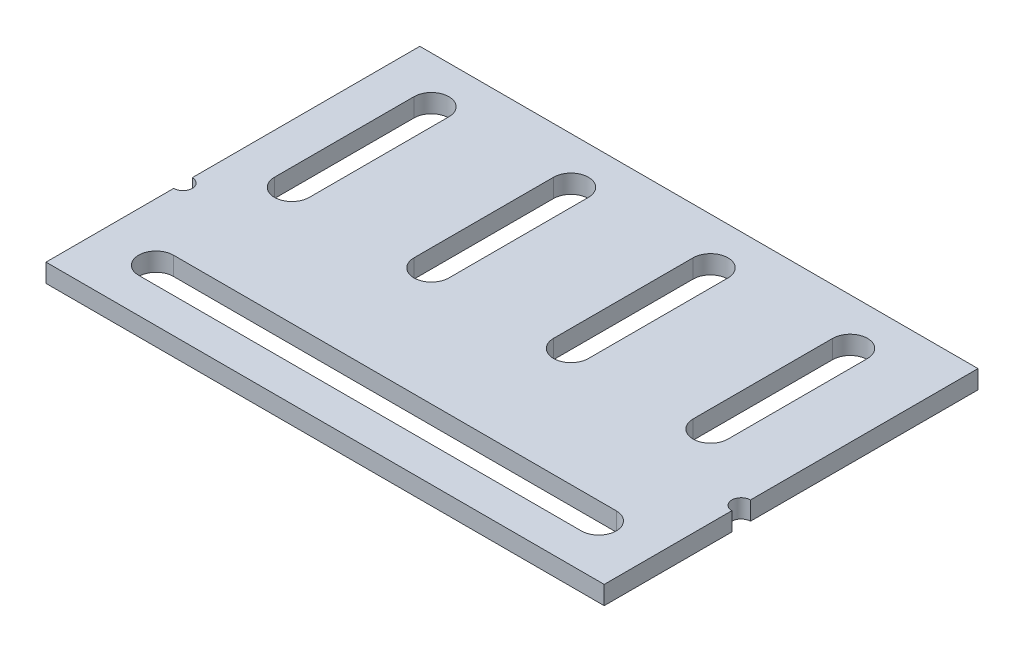
ISO-10303-21;
HEADER;
FILE_DESCRIPTION(('STEP AP214'),'2;1');
FILE_NAME('part.step','',(''),(''),'','','');
FILE_SCHEMA(('AUTOMOTIVE_DESIGN { 1 0 10303 214 1 1 1 1 }'));
ENDSEC;
DATA;
#1=APPLICATION_CONTEXT('core data for automotive mechanical design processes');
#2=APPLICATION_PROTOCOL_DEFINITION('international standard','automotive_design',2000,#1);
#3=PRODUCT_CONTEXT('',#1,'mechanical');
#4=PRODUCT('Part','Part','',(#3));
#5=PRODUCT_RELATED_PRODUCT_CATEGORY('part','',(#4));
#6=PRODUCT_DEFINITION_FORMATION('','',#4);
#7=PRODUCT_DEFINITION_CONTEXT('part definition',#1,'design');
#8=PRODUCT_DEFINITION('design','',#6,#7);
#9=PRODUCT_DEFINITION_SHAPE('','',#8);
#10=(LENGTH_UNIT() NAMED_UNIT(*) SI_UNIT(.MILLI.,.METRE.));
#11=(NAMED_UNIT(*) PLANE_ANGLE_UNIT() SI_UNIT($,.RADIAN.));
#12=(NAMED_UNIT(*) SI_UNIT($,.STERADIAN.) SOLID_ANGLE_UNIT());
#13=UNCERTAINTY_MEASURE_WITH_UNIT(LENGTH_MEASURE(1.E-05),#10,'distance_accuracy_value','');
#14=(GEOMETRIC_REPRESENTATION_CONTEXT(3) GLOBAL_UNCERTAINTY_ASSIGNED_CONTEXT((#13)) GLOBAL_UNIT_ASSIGNED_CONTEXT((#10,
#11,#12)) REPRESENTATION_CONTEXT('',''));
#15=CARTESIAN_POINT('',(0.,0.,0.));
#16=DIRECTION('',(0.,0.,1.));
#17=DIRECTION('',(1.,0.,0.));
#18=AXIS2_PLACEMENT_3D('',#15,#16,#17);
#19=CARTESIAN_POINT('',(120.,50.,-95.7213758827366));
#20=DIRECTION('',(1.,0.,0.));
#21=DIRECTION('',(0.,0.,1.));
#22=AXIS2_PLACEMENT_3D('',#19,#20,#21);
#23=PLANE('',#22);
#24=DIRECTION('',(0.,-1.,0.));
#25=VECTOR('',#24,1.);
#26=CARTESIAN_POINT('',(120.,57.9375,10.1080620586317));
#27=LINE('',#26,#25);
#28=CARTESIAN_POINT('',(120.,57.9375,10.1080620586317));
#29=VERTEX_POINT('',#28);
#30=CARTESIAN_POINT('',(120.,50.,10.1080620586317));
#31=VERTEX_POINT('',#30);
#32=EDGE_CURVE('E223',#29,#31,#27,.T.);
#33=ORIENTED_EDGE('',*,*,#32,.F.);
#34=DIRECTION('',(0.,0.,1.));
#35=VECTOR('',#34,1.);
#36=CARTESIAN_POINT('',(120.,57.9375,-45.7213758827366));
#37=LINE('',#36,#35);
#38=CARTESIAN_POINT('',(120.,57.9375,65.));
#39=VERTEX_POINT('',#38);
#40=EDGE_CURVE('E234',#29,#39,#37,.T.);
#41=ORIENTED_EDGE('',*,*,#40,.T.);
#42=DIRECTION('',(0.,-1.,0.));
#43=VECTOR('',#42,1.);
#44=CARTESIAN_POINT('',(120.,50.,65.));
#45=LINE('',#44,#43);
#46=CARTESIAN_POINT('',(120.,50.,65.));
#47=VERTEX_POINT('',#46);
#48=EDGE_CURVE('E446',#39,#47,#45,.T.);
#49=ORIENTED_EDGE('',*,*,#48,.T.);
#50=DIRECTION('',(0.,0.,1.));
#51=VECTOR('',#50,1.);
#52=CARTESIAN_POINT('',(120.,50.,-95.7213758827366));
#53=LINE('',#52,#51);
#54=EDGE_CURVE('E236',#31,#47,#53,.T.);
#55=ORIENTED_EDGE('',*,*,#54,.F.);
#56=EDGE_LOOP('',(#33,#41,#49,#55));
#57=FACE_BOUND('',#56,.T.);
#58=ADVANCED_FACE('F39',(#57),#23,.T.);
#59=CARTESIAN_POINT('',(-120.,50.,-95.7213758827366));
#60=DIRECTION('',(-1.,0.,0.));
#61=DIRECTION('',(0.,0.,-1.));
#62=AXIS2_PLACEMENT_3D('',#59,#60,#61);
#63=PLANE('',#62);
#64=DIRECTION('',(0.,-1.,0.));
#65=VECTOR('',#64,1.);
#66=CARTESIAN_POINT('',(-120.,57.9375,2.10806205863167));
#67=LINE('',#66,#65);
#68=CARTESIAN_POINT('',(-120.,57.9375,2.10806205863167));
#69=VERTEX_POINT('',#68);
#70=CARTESIAN_POINT('',(-120.,50.,2.10806205863167));
#71=VERTEX_POINT('',#70);
#72=EDGE_CURVE('E411',#69,#71,#67,.T.);
#73=ORIENTED_EDGE('',*,*,#72,.F.);
#74=DIRECTION('',(0.,0.,1.));
#75=VECTOR('',#74,1.);
#76=CARTESIAN_POINT('',(-120.,57.9375,-45.7213758827366));
#77=LINE('',#76,#75);
#78=CARTESIAN_POINT('',(-120.,57.9375,-95.7213758827366));
#79=VERTEX_POINT('',#78);
#80=EDGE_CURVE('E257',#69,#79,#77,.F.);
#81=ORIENTED_EDGE('',*,*,#80,.T.);
#82=DIRECTION('',(0.,-1.,0.));
#83=VECTOR('',#82,1.);
#84=CARTESIAN_POINT('',(-120.,50.,-95.7213758827366));
#85=LINE('',#84,#83);
#86=CARTESIAN_POINT('',(-120.,50.,-95.7213758827366));
#87=VERTEX_POINT('',#86);
#88=EDGE_CURVE('E308',#79,#87,#85,.T.);
#89=ORIENTED_EDGE('',*,*,#88,.T.);
#90=DIRECTION('',(0.,0.,-1.));
#91=VECTOR('',#90,1.);
#92=CARTESIAN_POINT('',(-120.,50.,-95.7213758827366));
#93=LINE('',#92,#91);
#94=EDGE_CURVE('E300',#71,#87,#93,.T.);
#95=ORIENTED_EDGE('',*,*,#94,.F.);
#96=EDGE_LOOP('',(#73,#81,#89,#95));
#97=FACE_BOUND('',#96,.T.);
#98=ADVANCED_FACE('F468',(#97),#63,.T.);
#99=CARTESIAN_POINT('',(92.4999999999999,50.,-15.7213758827366));
#100=DIRECTION('',(1.,0.,0.));
#101=DIRECTION('',(0.,0.,1.));
#102=AXIS2_PLACEMENT_3D('',#99,#100,#101);
#103=PLANE('',#102);
#104=DIRECTION('',(0.,-1.,0.));
#105=VECTOR('',#104,1.);
#106=CARTESIAN_POINT('',(92.4999999999999,50.,-15.7213758827366));
#107=LINE('',#106,#105);
#108=CARTESIAN_POINT('',(92.4999999999999,57.9375,-15.7213758827366));
#109=VERTEX_POINT('',#108);
#110=CARTESIAN_POINT('',(92.4999999999999,50.,-15.7213758827366));
#111=VERTEX_POINT('',#110);
#112=EDGE_CURVE('E47',#109,#111,#107,.T.);
#113=ORIENTED_EDGE('',*,*,#112,.F.);
#114=DIRECTION('',(0.,0.,1.));
#115=VECTOR('',#114,1.);
#116=CARTESIAN_POINT('',(92.4999999999999,57.9375,-45.7213758827366));
#117=LINE('',#116,#115);
#118=CARTESIAN_POINT('',(92.4999999999999,57.9375,-75.7213758827366));
#119=VERTEX_POINT('',#118);
#120=EDGE_CURVE('E301',#119,#109,#117,.T.);
#121=ORIENTED_EDGE('',*,*,#120,.F.);
#122=DIRECTION('',(0.,-1.,0.));
#123=VECTOR('',#122,1.);
#124=CARTESIAN_POINT('',(92.4999999999999,50.,-75.7213758827366));
#125=LINE('',#124,#123);
#126=CARTESIAN_POINT('',(92.4999999999999,50.,-75.7213758827366));
#127=VERTEX_POINT('',#126);
#128=EDGE_CURVE('E338',#119,#127,#125,.T.);
#129=ORIENTED_EDGE('',*,*,#128,.T.);
#130=DIRECTION('',(0.,0.,1.));
#131=VECTOR('',#130,1.);
#132=CARTESIAN_POINT('',(92.4999999999999,50.,-15.7213758827366));
#133=LINE('',#132,#131);
#134=EDGE_CURVE('E360',#127,#111,#133,.T.);
#135=ORIENTED_EDGE('',*,*,#134,.T.);
#136=EDGE_LOOP('',(#113,#121,#129,#135));
#137=FACE_BOUND('',#136,.T.);
#138=ADVANCED_FACE('F493',(#137),#103,.F.);
#139=CARTESIAN_POINT('',(84.9999999999999,50.,-75.7213758827366));
#140=DIRECTION('',(0.,-1.,0.));
#141=DIRECTION('',(1.,0.,0.));
#142=AXIS2_PLACEMENT_3D('',#139,#140,#141);
#143=CYLINDRICAL_SURFACE('',#142,7.5);
#144=ORIENTED_EDGE('',*,*,#128,.F.);
#145=CARTESIAN_POINT('',(84.9999999999999,57.9375,-75.7213758827366));
#146=DIRECTION('',(0.,-1.,0.));
#147=DIRECTION('',(1.,0.,0.));
#148=AXIS2_PLACEMENT_3D('',#145,#146,#147);
#149=CIRCLE('',#148,7.5);
#150=CARTESIAN_POINT('',(77.4999999999999,57.9375,-75.7213758827367));
#151=VERTEX_POINT('',#150);
#152=EDGE_CURVE('E297',#151,#119,#149,.T.);
#153=ORIENTED_EDGE('',*,*,#152,.F.);
#154=DIRECTION('',(0.,-1.,0.));
#155=VECTOR('',#154,1.);
#156=CARTESIAN_POINT('',(77.4999999999999,50.,-75.7213758827367));
#157=LINE('',#156,#155);
#158=CARTESIAN_POINT('',(77.4999999999999,50.,-75.7213758827367));
#159=VERTEX_POINT('',#158);
#160=EDGE_CURVE('E336',#151,#159,#157,.T.);
#161=ORIENTED_EDGE('',*,*,#160,.T.);
#162=CARTESIAN_POINT('',(84.9999999999999,50.,-75.7213758827366));
#163=DIRECTION('',(0.,-1.,0.));
#164=DIRECTION('',(1.,0.,0.));
#165=AXIS2_PLACEMENT_3D('',#162,#163,#164);
#166=CIRCLE('',#165,7.5);
#167=EDGE_CURVE('E252',#159,#127,#166,.T.);
#168=ORIENTED_EDGE('',*,*,#167,.T.);
#169=EDGE_LOOP('',(#144,#153,#161,#168));
#170=FACE_BOUND('',#169,.T.);
#171=ADVANCED_FACE('F554',(#170),#143,.F.);
#172=CARTESIAN_POINT('',(77.4999999999999,50.,-15.7213758827366));
#173=DIRECTION('',(-1.,0.,0.));
#174=DIRECTION('',(0.,0.,-1.));
#175=AXIS2_PLACEMENT_3D('',#172,#173,#174);
#176=PLANE('',#175);
#177=ORIENTED_EDGE('',*,*,#160,.F.);
#178=DIRECTION('',(0.,0.,1.));
#179=VECTOR('',#178,1.);
#180=CARTESIAN_POINT('',(77.4999999999999,57.9375,-45.7213758827366));
#181=LINE('',#180,#179);
#182=CARTESIAN_POINT('',(77.4999999999999,57.9375,-15.7213758827366));
#183=VERTEX_POINT('',#182);
#184=EDGE_CURVE('E288',#183,#151,#181,.F.);
#185=ORIENTED_EDGE('',*,*,#184,.F.);
#186=DIRECTION('',(0.,-1.,0.));
#187=VECTOR('',#186,1.);
#188=CARTESIAN_POINT('',(77.4999999999999,50.,-15.7213758827366));
#189=LINE('',#188,#187);
#190=CARTESIAN_POINT('',(77.4999999999999,50.,-15.7213758827366));
#191=VERTEX_POINT('',#190);
#192=EDGE_CURVE('E334',#183,#191,#189,.T.);
#193=ORIENTED_EDGE('',*,*,#192,.T.);
#194=DIRECTION('',(0.,0.,-1.));
#195=VECTOR('',#194,1.);
#196=CARTESIAN_POINT('',(77.4999999999999,50.,-15.7213758827366));
#197=LINE('',#196,#195);
#198=EDGE_CURVE('E345',#191,#159,#197,.T.);
#199=ORIENTED_EDGE('',*,*,#198,.T.);
#200=EDGE_LOOP('',(#177,#185,#193,#199));
#201=FACE_BOUND('',#200,.T.);
#202=ADVANCED_FACE('F344',(#201),#176,.F.);
#203=CARTESIAN_POINT('',(32.4999999999999,50.,-15.7213758827366));
#204=DIRECTION('',(1.,0.,0.));
#205=DIRECTION('',(0.,0.,1.));
#206=AXIS2_PLACEMENT_3D('',#203,#204,#205);
#207=PLANE('',#206);
#208=DIRECTION('',(0.,-1.,0.));
#209=VECTOR('',#208,1.);
#210=CARTESIAN_POINT('',(32.4999999999999,50.,-15.7213758827366));
#211=LINE('',#210,#209);
#212=CARTESIAN_POINT('',(32.4999999999999,57.9375,-15.7213758827366));
#213=VERTEX_POINT('',#212);
#214=CARTESIAN_POINT('',(32.4999999999999,50.,-15.7213758827366));
#215=VERTEX_POINT('',#214);
#216=EDGE_CURVE('E332',#213,#215,#211,.T.);
#217=ORIENTED_EDGE('',*,*,#216,.F.);
#218=DIRECTION('',(0.,0.,1.));
#219=VECTOR('',#218,1.);
#220=CARTESIAN_POINT('',(32.4999999999999,57.9375,-45.7213758827366));
#221=LINE('',#220,#219);
#222=CARTESIAN_POINT('',(32.4999999999999,57.9375,-75.7213758827366));
#223=VERTEX_POINT('',#222);
#224=EDGE_CURVE('E289',#223,#213,#221,.T.);
#225=ORIENTED_EDGE('',*,*,#224,.F.);
#226=DIRECTION('',(0.,-1.,0.));
#227=VECTOR('',#226,1.);
#228=CARTESIAN_POINT('',(32.4999999999999,50.,-75.7213758827366));
#229=LINE('',#228,#227);
#230=CARTESIAN_POINT('',(32.4999999999999,50.,-75.7213758827366));
#231=VERTEX_POINT('',#230);
#232=EDGE_CURVE('E330',#223,#231,#229,.T.);
#233=ORIENTED_EDGE('',*,*,#232,.T.);
#234=DIRECTION('',(0.,0.,1.));
#235=VECTOR('',#234,1.);
#236=CARTESIAN_POINT('',(32.4999999999999,50.,-15.7213758827366));
#237=LINE('',#236,#235);
#238=EDGE_CURVE('E365',#231,#215,#237,.T.);
#239=ORIENTED_EDGE('',*,*,#238,.T.);
#240=EDGE_LOOP('',(#217,#225,#233,#239));
#241=FACE_BOUND('',#240,.T.);
#242=ADVANCED_FACE('F544',(#241),#207,.F.);
#243=CARTESIAN_POINT('',(24.9999999999999,50.,-75.7213758827366));
#244=DIRECTION('',(0.,-1.,0.));
#245=DIRECTION('',(1.,0.,0.));
#246=AXIS2_PLACEMENT_3D('',#243,#244,#245);
#247=CYLINDRICAL_SURFACE('',#246,7.5);
#248=ORIENTED_EDGE('',*,*,#232,.F.);
#249=CARTESIAN_POINT('',(24.9999999999999,57.9375,-75.7213758827366));
#250=DIRECTION('',(0.,-1.,0.));
#251=DIRECTION('',(1.,0.,0.));
#252=AXIS2_PLACEMENT_3D('',#249,#250,#251);
#253=CIRCLE('',#252,7.5);
#254=CARTESIAN_POINT('',(17.4999999999999,57.9375,-75.7213758827366));
#255=VERTEX_POINT('',#254);
#256=EDGE_CURVE('E285',#255,#223,#253,.T.);
#257=ORIENTED_EDGE('',*,*,#256,.F.);
#258=DIRECTION('',(0.,-1.,0.));
#259=VECTOR('',#258,1.);
#260=CARTESIAN_POINT('',(17.4999999999999,50.,-75.7213758827366));
#261=LINE('',#260,#259);
#262=CARTESIAN_POINT('',(17.4999999999999,50.,-75.7213758827366));
#263=VERTEX_POINT('',#262);
#264=EDGE_CURVE('E328',#255,#263,#261,.T.);
#265=ORIENTED_EDGE('',*,*,#264,.T.);
#266=CARTESIAN_POINT('',(24.9999999999999,50.,-75.7213758827366));
#267=DIRECTION('',(0.,-1.,0.));
#268=DIRECTION('',(1.,0.,0.));
#269=AXIS2_PLACEMENT_3D('',#266,#267,#268);
#270=CIRCLE('',#269,7.5);
#271=EDGE_CURVE('E357',#263,#231,#270,.T.);
#272=ORIENTED_EDGE('',*,*,#271,.T.);
#273=EDGE_LOOP('',(#248,#257,#265,#272));
#274=FACE_BOUND('',#273,.T.);
#275=ADVANCED_FACE('F540',(#274),#247,.F.);
#276=CARTESIAN_POINT('',(17.4999999999999,50.,-15.7213758827366));
#277=DIRECTION('',(-1.,0.,0.));
#278=DIRECTION('',(0.,0.,-1.));
#279=AXIS2_PLACEMENT_3D('',#276,#277,#278);
#280=PLANE('',#279);
#281=ORIENTED_EDGE('',*,*,#264,.F.);
#282=DIRECTION('',(0.,0.,1.));
#283=VECTOR('',#282,1.);
#284=CARTESIAN_POINT('',(17.4999999999999,57.9375,-45.7213758827366));
#285=LINE('',#284,#283);
#286=CARTESIAN_POINT('',(17.4999999999999,57.9375,-15.7213758827366));
#287=VERTEX_POINT('',#286);
#288=EDGE_CURVE('E276',#287,#255,#285,.F.);
#289=ORIENTED_EDGE('',*,*,#288,.F.);
#290=DIRECTION('',(0.,-1.,0.));
#291=VECTOR('',#290,1.);
#292=CARTESIAN_POINT('',(17.4999999999999,50.,-15.7213758827366));
#293=LINE('',#292,#291);
#294=CARTESIAN_POINT('',(17.4999999999999,50.,-15.7213758827366));
#295=VERTEX_POINT('',#294);
#296=EDGE_CURVE('E326',#287,#295,#293,.T.);
#297=ORIENTED_EDGE('',*,*,#296,.T.);
#298=DIRECTION('',(0.,0.,-1.));
#299=VECTOR('',#298,1.);
#300=CARTESIAN_POINT('',(17.4999999999999,50.,-15.7213758827366));
#301=LINE('',#300,#299);
#302=EDGE_CURVE('E371',#295,#263,#301,.T.);
#303=ORIENTED_EDGE('',*,*,#302,.T.);
#304=EDGE_LOOP('',(#281,#289,#297,#303));
#305=FACE_BOUND('',#304,.T.);
#306=ADVANCED_FACE('F532',(#305),#280,.F.);
#307=CARTESIAN_POINT('',(-27.5000000000001,50.,-15.7213758827366));
#308=DIRECTION('',(1.,0.,0.));
#309=DIRECTION('',(0.,0.,1.));
#310=AXIS2_PLACEMENT_3D('',#307,#308,#309);
#311=PLANE('',#310);
#312=DIRECTION('',(0.,-1.,0.));
#313=VECTOR('',#312,1.);
#314=CARTESIAN_POINT('',(-27.5000000000001,50.,-15.7213758827366));
#315=LINE('',#314,#313);
#316=CARTESIAN_POINT('',(-27.5000000000001,57.9375,-15.7213758827366));
#317=VERTEX_POINT('',#316);
#318=CARTESIAN_POINT('',(-27.5000000000001,50.,-15.7213758827366));
#319=VERTEX_POINT('',#318);
#320=EDGE_CURVE('E324',#317,#319,#315,.T.);
#321=ORIENTED_EDGE('',*,*,#320,.F.);
#322=DIRECTION('',(0.,0.,1.));
#323=VECTOR('',#322,1.);
#324=CARTESIAN_POINT('',(-27.5000000000001,57.9375,-45.7213758827366));
#325=LINE('',#324,#323);
#326=CARTESIAN_POINT('',(-27.5000000000001,57.9375,-75.7213758827366));
#327=VERTEX_POINT('',#326);
#328=EDGE_CURVE('E277',#327,#317,#325,.T.);
#329=ORIENTED_EDGE('',*,*,#328,.F.);
#330=DIRECTION('',(0.,-1.,0.));
#331=VECTOR('',#330,1.);
#332=CARTESIAN_POINT('',(-27.5000000000001,50.,-75.7213758827366));
#333=LINE('',#332,#331);
#334=CARTESIAN_POINT('',(-27.5000000000001,50.,-75.7213758827366));
#335=VERTEX_POINT('',#334);
#336=EDGE_CURVE('E322',#327,#335,#333,.T.);
#337=ORIENTED_EDGE('',*,*,#336,.T.);
#338=DIRECTION('',(0.,0.,1.));
#339=VECTOR('',#338,1.);
#340=CARTESIAN_POINT('',(-27.5000000000001,50.,-15.7213758827366));
#341=LINE('',#340,#339);
#342=EDGE_CURVE('E377',#335,#319,#341,.T.);
#343=ORIENTED_EDGE('',*,*,#342,.T.);
#344=EDGE_LOOP('',(#321,#329,#337,#343));
#345=FACE_BOUND('',#344,.T.);
#346=ADVANCED_FACE('F528',(#345),#311,.F.);
#347=CARTESIAN_POINT('',(-35.0000000000001,50.,-75.7213758827366));
#348=DIRECTION('',(0.,-1.,0.));
#349=DIRECTION('',(1.,0.,0.));
#350=AXIS2_PLACEMENT_3D('',#347,#348,#349);
#351=CYLINDRICAL_SURFACE('',#350,7.5);
#352=ORIENTED_EDGE('',*,*,#336,.F.);
#353=CARTESIAN_POINT('',(-35.0000000000001,57.9375,-75.7213758827366));
#354=DIRECTION('',(0.,-1.,0.));
#355=DIRECTION('',(1.,0.,0.));
#356=AXIS2_PLACEMENT_3D('',#353,#354,#355);
#357=CIRCLE('',#356,7.5);
#358=CARTESIAN_POINT('',(-42.5000000000001,57.9375,-75.7213758827366));
#359=VERTEX_POINT('',#358);
#360=EDGE_CURVE('E273',#359,#327,#357,.T.);
#361=ORIENTED_EDGE('',*,*,#360,.F.);
#362=DIRECTION('',(0.,-1.,0.));
#363=VECTOR('',#362,1.);
#364=CARTESIAN_POINT('',(-42.5000000000001,50.,-75.7213758827366));
#365=LINE('',#364,#363);
#366=CARTESIAN_POINT('',(-42.5000000000001,50.,-75.7213758827366));
#367=VERTEX_POINT('',#366);
#368=EDGE_CURVE('E320',#359,#367,#365,.T.);
#369=ORIENTED_EDGE('',*,*,#368,.T.);
#370=CARTESIAN_POINT('',(-35.0000000000001,50.,-75.7213758827366));
#371=DIRECTION('',(0.,-1.,0.));
#372=DIRECTION('',(1.,0.,0.));
#373=AXIS2_PLACEMENT_3D('',#370,#371,#372);
#374=CIRCLE('',#373,7.5);
#375=EDGE_CURVE('E374',#367,#335,#374,.T.);
#376=ORIENTED_EDGE('',*,*,#375,.T.);
#377=EDGE_LOOP('',(#352,#361,#369,#376));
#378=FACE_BOUND('',#377,.T.);
#379=ADVANCED_FACE('F524',(#378),#351,.F.);
#380=CARTESIAN_POINT('',(-42.5,50.,-15.7213758827366));
#381=DIRECTION('',(-1.,0.,0.));
#382=DIRECTION('',(0.,0.,-1.));
#383=AXIS2_PLACEMENT_3D('',#380,#381,#382);
#384=PLANE('',#383);
#385=ORIENTED_EDGE('',*,*,#368,.F.);
#386=DIRECTION('',(0.,0.,1.));
#387=VECTOR('',#386,1.);
#388=CARTESIAN_POINT('',(-42.5,57.9375,-45.7213758827366));
#389=LINE('',#388,#387);
#390=CARTESIAN_POINT('',(-42.5,57.9375,-15.7213758827366));
#391=VERTEX_POINT('',#390);
#392=EDGE_CURVE('E264',#391,#359,#389,.F.);
#393=ORIENTED_EDGE('',*,*,#392,.F.);
#394=DIRECTION('',(0.,-1.,0.));
#395=VECTOR('',#394,1.);
#396=CARTESIAN_POINT('',(-42.5,50.,-15.7213758827366));
#397=LINE('',#396,#395);
#398=CARTESIAN_POINT('',(-42.5,50.,-15.7213758827366));
#399=VERTEX_POINT('',#398);
#400=EDGE_CURVE('E318',#391,#399,#397,.T.);
#401=ORIENTED_EDGE('',*,*,#400,.T.);
#402=DIRECTION('',(0.,0.,-1.));
#403=VECTOR('',#402,1.);
#404=CARTESIAN_POINT('',(-42.5,50.,-15.7213758827366));
#405=LINE('',#404,#403);
#406=EDGE_CURVE('E383',#399,#367,#405,.T.);
#407=ORIENTED_EDGE('',*,*,#406,.T.);
#408=EDGE_LOOP('',(#385,#393,#401,#407));
#409=FACE_BOUND('',#408,.T.);
#410=ADVANCED_FACE('F519',(#409),#384,.F.);
#411=CARTESIAN_POINT('',(-87.5000000000001,50.,-15.7213758827366));
#412=DIRECTION('',(1.,0.,0.));
#413=DIRECTION('',(0.,0.,1.));
#414=AXIS2_PLACEMENT_3D('',#411,#412,#413);
#415=PLANE('',#414);
#416=DIRECTION('',(0.,-1.,0.));
#417=VECTOR('',#416,1.);
#418=CARTESIAN_POINT('',(-87.5000000000001,50.,-15.7213758827366));
#419=LINE('',#418,#417);
#420=CARTESIAN_POINT('',(-87.5000000000001,57.9375,-15.7213758827366));
#421=VERTEX_POINT('',#420);
#422=CARTESIAN_POINT('',(-87.5000000000001,50.,-15.7213758827366));
#423=VERTEX_POINT('',#422);
#424=EDGE_CURVE('E316',#421,#423,#419,.T.);
#425=ORIENTED_EDGE('',*,*,#424,.F.);
#426=DIRECTION('',(0.,0.,1.));
#427=VECTOR('',#426,1.);
#428=CARTESIAN_POINT('',(-87.5,57.9375,-45.7213758827366));
#429=LINE('',#428,#427);
#430=CARTESIAN_POINT('',(-87.5,57.9375,-75.7213758827366));
#431=VERTEX_POINT('',#430);
#432=EDGE_CURVE('E265',#431,#421,#429,.T.);
#433=ORIENTED_EDGE('',*,*,#432,.F.);
#434=DIRECTION('',(0.,-1.,0.));
#435=VECTOR('',#434,1.);
#436=CARTESIAN_POINT('',(-87.5,50.,-75.7213758827366));
#437=LINE('',#436,#435);
#438=CARTESIAN_POINT('',(-87.5,50.,-75.7213758827366));
#439=VERTEX_POINT('',#438);
#440=EDGE_CURVE('E314',#431,#439,#437,.T.);
#441=ORIENTED_EDGE('',*,*,#440,.T.);
#442=DIRECTION('',(0.,0.,1.));
#443=VECTOR('',#442,1.);
#444=CARTESIAN_POINT('',(-87.5000000000001,50.,-15.7213758827366));
#445=LINE('',#444,#443);
#446=EDGE_CURVE('E389',#439,#423,#445,.T.);
#447=ORIENTED_EDGE('',*,*,#446,.T.);
#448=EDGE_LOOP('',(#425,#433,#441,#447));
#449=FACE_BOUND('',#448,.T.);
#450=ADVANCED_FACE('F516',(#449),#415,.F.);
#451=CARTESIAN_POINT('',(-95.0000000000001,50.,-75.7213758827366));
#452=DIRECTION('',(0.,-1.,0.));
#453=DIRECTION('',(1.,0.,0.));
#454=AXIS2_PLACEMENT_3D('',#451,#452,#453);
#455=CYLINDRICAL_SURFACE('',#454,7.50000000000003);
#456=ORIENTED_EDGE('',*,*,#440,.F.);
#457=CARTESIAN_POINT('',(-95.0000000000001,57.9375,-75.7213758827366));
#458=DIRECTION('',(0.,-1.,0.));
#459=DIRECTION('',(1.,0.,0.));
#460=AXIS2_PLACEMENT_3D('',#457,#458,#459);
#461=CIRCLE('',#460,7.50000000000003);
#462=CARTESIAN_POINT('',(-102.5,57.9375,-75.7213758827366));
#463=VERTEX_POINT('',#462);
#464=EDGE_CURVE('E261',#463,#431,#461,.T.);
#465=ORIENTED_EDGE('',*,*,#464,.F.);
#466=DIRECTION('',(0.,-1.,0.));
#467=VECTOR('',#466,1.);
#468=CARTESIAN_POINT('',(-102.5,50.,-75.7213758827366));
#469=LINE('',#468,#467);
#470=CARTESIAN_POINT('',(-102.5,50.,-75.7213758827366));
#471=VERTEX_POINT('',#470);
#472=EDGE_CURVE('E312',#463,#471,#469,.T.);
#473=ORIENTED_EDGE('',*,*,#472,.T.);
#474=CARTESIAN_POINT('',(-95.0000000000001,50.,-75.7213758827366));
#475=DIRECTION('',(0.,-1.,0.));
#476=DIRECTION('',(1.,0.,0.));
#477=AXIS2_PLACEMENT_3D('',#474,#475,#476);
#478=CIRCLE('',#477,7.50000000000003);
#479=EDGE_CURVE('E386',#471,#439,#478,.T.);
#480=ORIENTED_EDGE('',*,*,#479,.T.);
#481=EDGE_LOOP('',(#456,#465,#473,#480));
#482=FACE_BOUND('',#481,.T.);
#483=ADVANCED_FACE('F512',(#482),#455,.F.);
#484=CARTESIAN_POINT('',(-102.5,50.,-15.7213758827366));
#485=DIRECTION('',(-1.,0.,0.));
#486=DIRECTION('',(0.,0.,-1.));
#487=AXIS2_PLACEMENT_3D('',#484,#485,#486);
#488=PLANE('',#487);
#489=ORIENTED_EDGE('',*,*,#472,.F.);
#490=DIRECTION('',(0.,0.,1.));
#491=VECTOR('',#490,1.);
#492=CARTESIAN_POINT('',(-102.5,57.9375,-45.7213758827366));
#493=LINE('',#492,#491);
#494=CARTESIAN_POINT('',(-102.5,57.9375,-15.7213758827366));
#495=VERTEX_POINT('',#494);
#496=EDGE_CURVE('E247',#495,#463,#493,.F.);
#497=ORIENTED_EDGE('',*,*,#496,.F.);
#498=DIRECTION('',(0.,-1.,0.));
#499=VECTOR('',#498,1.);
#500=CARTESIAN_POINT('',(-102.5,50.,-15.7213758827366));
#501=LINE('',#500,#499);
#502=CARTESIAN_POINT('',(-102.5,50.,-15.7213758827366));
#503=VERTEX_POINT('',#502);
#504=EDGE_CURVE('E311',#495,#503,#501,.T.);
#505=ORIENTED_EDGE('',*,*,#504,.T.);
#506=DIRECTION('',(0.,0.,-1.));
#507=VECTOR('',#506,1.);
#508=CARTESIAN_POINT('',(-102.5,50.,-15.7213758827366));
#509=LINE('',#508,#507);
#510=EDGE_CURVE('E395',#503,#471,#509,.T.);
#511=ORIENTED_EDGE('',*,*,#510,.T.);
#512=EDGE_LOOP('',(#489,#497,#505,#511));
#513=FACE_BOUND('',#512,.T.);
#514=ADVANCED_FACE('F508',(#513),#488,.F.);
#515=DIRECTION('',(0.,-1.,0.));
#516=VECTOR('',#515,1.);
#517=CARTESIAN_POINT('',(-120.,57.9375,10.1080620586317));
#518=LINE('',#517,#516);
#519=CARTESIAN_POINT('',(-120.,50.,10.1080620586317));
#520=VERTEX_POINT('',#519);
#521=CARTESIAN_POINT('',(-120.,57.9375,10.1080620586317));
#522=VERTEX_POINT('',#521);
#523=EDGE_CURVE('E62',#520,#522,#518,.F.);
#524=ORIENTED_EDGE('',*,*,#523,.F.);
#525=CARTESIAN_POINT('',(-120.,50.,65.));
#526=VERTEX_POINT('',#525);
#527=EDGE_CURVE('E404',#526,#520,#93,.T.);
#528=ORIENTED_EDGE('',*,*,#527,.F.);
#529=DIRECTION('',(0.,-1.,0.));
#530=VECTOR('',#529,1.);
#531=CARTESIAN_POINT('',(-120.,50.,65.));
#532=LINE('',#531,#530);
#533=CARTESIAN_POINT('',(-120.,57.9375,65.));
#534=VERTEX_POINT('',#533);
#535=EDGE_CURVE('E407',#534,#526,#532,.T.);
#536=ORIENTED_EDGE('',*,*,#535,.F.);
#537=EDGE_CURVE('E249',#534,#522,#77,.F.);
#538=ORIENTED_EDGE('',*,*,#537,.T.);
#539=EDGE_LOOP('',(#524,#528,#536,#538));
#540=FACE_BOUND('',#539,.T.);
#541=ADVANCED_FACE('F473',(#540),#63,.T.);
#542=CARTESIAN_POINT('',(120.,50.,-95.7213758827366));
#543=DIRECTION('',(0.,0.,-1.));
#544=DIRECTION('',(1.,0.,0.));
#545=AXIS2_PLACEMENT_3D('',#542,#543,#544);
#546=PLANE('',#545);
#547=ORIENTED_EDGE('',*,*,#88,.F.);
#548=DIRECTION('',(1.,0.,0.));
#549=VECTOR('',#548,1.);
#550=CARTESIAN_POINT('',(0.,57.9375,-95.7213758827366));
#551=LINE('',#550,#549);
#552=CARTESIAN_POINT('',(120.,57.9375,-95.7213758827366));
#553=VERTEX_POINT('',#552);
#554=EDGE_CURVE('E245',#79,#553,#551,.T.);
#555=ORIENTED_EDGE('',*,*,#554,.T.);
#556=DIRECTION('',(0.,-1.,0.));
#557=VECTOR('',#556,1.);
#558=CARTESIAN_POINT('',(120.,50.,-95.7213758827366));
#559=LINE('',#558,#557);
#560=CARTESIAN_POINT('',(120.,50.,-95.7213758827366));
#561=VERTEX_POINT('',#560);
#562=EDGE_CURVE('E306',#553,#561,#559,.T.);
#563=ORIENTED_EDGE('',*,*,#562,.T.);
#564=DIRECTION('',(1.,0.,0.));
#565=VECTOR('',#564,1.);
#566=CARTESIAN_POINT('',(120.,50.,-95.7213758827366));
#567=LINE('',#566,#565);
#568=EDGE_CURVE('E401',#87,#561,#567,.T.);
#569=ORIENTED_EDGE('',*,*,#568,.F.);
#570=EDGE_LOOP('',(#547,#555,#563,#569));
#571=FACE_BOUND('',#570,.T.);
#572=ADVANCED_FACE('F463',(#571),#546,.T.);
#573=DIRECTION('',(0.,-1.,0.));
#574=VECTOR('',#573,1.);
#575=CARTESIAN_POINT('',(120.,57.9375,2.10806205863169));
#576=LINE('',#575,#574);
#577=CARTESIAN_POINT('',(120.,50.,2.10806205863169));
#578=VERTEX_POINT('',#577);
#579=CARTESIAN_POINT('',(120.,57.9375,2.10806205863169));
#580=VERTEX_POINT('',#579);
#581=EDGE_CURVE('E54',#578,#580,#576,.F.);
#582=ORIENTED_EDGE('',*,*,#581,.F.);
#583=EDGE_CURVE('E398',#561,#578,#53,.T.);
#584=ORIENTED_EDGE('',*,*,#583,.F.);
#585=ORIENTED_EDGE('',*,*,#562,.F.);
#586=EDGE_CURVE('E244',#553,#580,#37,.T.);
#587=ORIENTED_EDGE('',*,*,#586,.T.);
#588=EDGE_LOOP('',(#582,#584,#585,#587));
#589=FACE_BOUND('',#588,.T.);
#590=ADVANCED_FACE('F456',(#589),#23,.T.);
#591=CARTESIAN_POINT('',(-95.0000000000001,50.,-15.7213758827366));
#592=DIRECTION('',(0.,-1.,0.));
#593=DIRECTION('',(1.,0.,0.));
#594=AXIS2_PLACEMENT_3D('',#591,#592,#593);
#595=CYLINDRICAL_SURFACE('',#594,7.50000000000001);
#596=CARTESIAN_POINT('',(-95.0000000000001,57.9375,-15.7213758827366));
#597=DIRECTION('',(0.,-1.,0.));
#598=DIRECTION('',(1.,0.,0.));
#599=AXIS2_PLACEMENT_3D('',#596,#597,#598);
#600=CIRCLE('',#599,7.50000000000001);
#601=EDGE_CURVE('E260',#421,#495,#600,.T.);
#602=ORIENTED_EDGE('',*,*,#601,.F.);
#603=ORIENTED_EDGE('',*,*,#424,.T.);
#604=CARTESIAN_POINT('',(-95.0000000000001,50.,-15.7213758827366));
#605=DIRECTION('',(0.,-1.,0.));
#606=DIRECTION('',(1.,0.,0.));
#607=AXIS2_PLACEMENT_3D('',#604,#605,#606);
#608=CIRCLE('',#607,7.50000000000001);
#609=EDGE_CURVE('E392',#423,#503,#608,.T.);
#610=ORIENTED_EDGE('',*,*,#609,.T.);
#611=ORIENTED_EDGE('',*,*,#504,.F.);
#612=EDGE_LOOP('',(#602,#603,#610,#611));
#613=FACE_BOUND('',#612,.T.);
#614=ADVANCED_FACE('F497',(#613),#595,.F.);
#615=CARTESIAN_POINT('',(-35.0000000000001,50.,-15.7213758827366));
#616=DIRECTION('',(0.,-1.,0.));
#617=DIRECTION('',(1.,0.,0.));
#618=AXIS2_PLACEMENT_3D('',#615,#616,#617);
#619=CYLINDRICAL_SURFACE('',#618,7.49999999999999);
#620=CARTESIAN_POINT('',(-35.0000000000001,57.9375,-15.7213758827366));
#621=DIRECTION('',(0.,-1.,0.));
#622=DIRECTION('',(1.,0.,0.));
#623=AXIS2_PLACEMENT_3D('',#620,#621,#622);
#624=CIRCLE('',#623,7.49999999999999);
#625=EDGE_CURVE('E272',#317,#391,#624,.T.);
#626=ORIENTED_EDGE('',*,*,#625,.F.);
#627=ORIENTED_EDGE('',*,*,#320,.T.);
#628=CARTESIAN_POINT('',(-35.0000000000001,50.,-15.7213758827366));
#629=DIRECTION('',(0.,-1.,0.));
#630=DIRECTION('',(1.,0.,0.));
#631=AXIS2_PLACEMENT_3D('',#628,#629,#630);
#632=CIRCLE('',#631,7.49999999999999);
#633=EDGE_CURVE('E380',#319,#399,#632,.T.);
#634=ORIENTED_EDGE('',*,*,#633,.T.);
#635=ORIENTED_EDGE('',*,*,#400,.F.);
#636=EDGE_LOOP('',(#626,#627,#634,#635));
#637=FACE_BOUND('',#636,.T.);
#638=ADVANCED_FACE('F502',(#637),#619,.F.);
#639=CARTESIAN_POINT('',(24.9999999999999,50.,-15.7213758827366));
#640=DIRECTION('',(0.,-1.,0.));
#641=DIRECTION('',(1.,0.,0.));
#642=AXIS2_PLACEMENT_3D('',#639,#640,#641);
#643=CYLINDRICAL_SURFACE('',#642,7.5);
#644=CARTESIAN_POINT('',(24.9999999999999,57.9375,-15.7213758827366));
#645=DIRECTION('',(0.,-1.,0.));
#646=DIRECTION('',(1.,0.,0.));
#647=AXIS2_PLACEMENT_3D('',#644,#645,#646);
#648=CIRCLE('',#647,7.5);
#649=EDGE_CURVE('E284',#213,#287,#648,.T.);
#650=ORIENTED_EDGE('',*,*,#649,.F.);
#651=ORIENTED_EDGE('',*,*,#216,.T.);
#652=CARTESIAN_POINT('',(24.9999999999999,50.,-15.7213758827366));
#653=DIRECTION('',(0.,-1.,0.));
#654=DIRECTION('',(1.,0.,0.));
#655=AXIS2_PLACEMENT_3D('',#652,#653,#654);
#656=CIRCLE('',#655,7.5);
#657=EDGE_CURVE('E368',#215,#295,#656,.T.);
#658=ORIENTED_EDGE('',*,*,#657,.T.);
#659=ORIENTED_EDGE('',*,*,#296,.F.);
#660=EDGE_LOOP('',(#650,#651,#658,#659));
#661=FACE_BOUND('',#660,.T.);
#662=ADVANCED_FACE('F536',(#661),#643,.F.);
#663=CARTESIAN_POINT('',(84.9999999999999,50.,-15.7213758827366));
#664=DIRECTION('',(0.,-1.,0.));
#665=DIRECTION('',(1.,0.,0.));
#666=AXIS2_PLACEMENT_3D('',#663,#664,#665);
#667=CYLINDRICAL_SURFACE('',#666,7.49999999999999);
#668=CARTESIAN_POINT('',(84.9999999999999,57.9375,-15.7213758827366));
#669=DIRECTION('',(0.,-1.,0.));
#670=DIRECTION('',(1.,0.,0.));
#671=AXIS2_PLACEMENT_3D('',#668,#669,#670);
#672=CIRCLE('',#671,7.49999999999999);
#673=EDGE_CURVE('E296',#109,#183,#672,.T.);
#674=ORIENTED_EDGE('',*,*,#673,.F.);
#675=ORIENTED_EDGE('',*,*,#112,.T.);
#676=CARTESIAN_POINT('',(84.9999999999999,50.,-15.7213758827366));
#677=DIRECTION('',(0.,-1.,0.));
#678=DIRECTION('',(1.,0.,0.));
#679=AXIS2_PLACEMENT_3D('',#676,#677,#678);
#680=CIRCLE('',#679,7.49999999999999);
#681=EDGE_CURVE('E354',#111,#191,#680,.T.);
#682=ORIENTED_EDGE('',*,*,#681,.T.);
#683=ORIENTED_EDGE('',*,*,#192,.F.);
#684=EDGE_LOOP('',(#674,#675,#682,#683));
#685=FACE_BOUND('',#684,.T.);
#686=ADVANCED_FACE('F359',(#685),#667,.F.);
#687=CARTESIAN_POINT('',(0.,50.,0.));
#688=DIRECTION('',(0.,-1.,0.));
#689=DIRECTION('',(1.,0.,0.));
#690=AXIS2_PLACEMENT_3D('',#687,#688,#689);
#691=PLANE('',#690);
#692=CARTESIAN_POINT('',(120.,50.,6.1080620586317));
#693=DIRECTION('',(0.,-1.,0.));
#694=DIRECTION('',(1.,0.,0.));
#695=AXIS2_PLACEMENT_3D('',#692,#693,#694);
#696=CIRCLE('',#695,4.00000000000001);
#697=EDGE_CURVE('E229',#31,#578,#696,.T.);
#698=ORIENTED_EDGE('',*,*,#697,.F.);
#699=ORIENTED_EDGE('',*,*,#54,.T.);
#700=DIRECTION('',(1.,0.,0.));
#701=VECTOR('',#700,1.);
#702=CARTESIAN_POINT('',(120.,50.,65.));
#703=LINE('',#702,#701);
#704=EDGE_CURVE('E410',#526,#47,#703,.T.);
#705=ORIENTED_EDGE('',*,*,#704,.F.);
#706=ORIENTED_EDGE('',*,*,#527,.T.);
#707=CARTESIAN_POINT('',(-120.,50.,6.10806205863168));
#708=DIRECTION('',(0.,-1.,0.));
#709=DIRECTION('',(1.,0.,0.));
#710=AXIS2_PLACEMENT_3D('',#707,#708,#709);
#711=CIRCLE('',#710,4.00000000000001);
#712=EDGE_CURVE('E237',#71,#520,#711,.T.);
#713=ORIENTED_EDGE('',*,*,#712,.F.);
#714=ORIENTED_EDGE('',*,*,#94,.T.);
#715=ORIENTED_EDGE('',*,*,#568,.T.);
#716=ORIENTED_EDGE('',*,*,#583,.T.);
#717=EDGE_LOOP('',(#698,#699,#705,#706,#713,#714,#715,#716));
#718=FACE_BOUND('',#717,.T.);
#719=ORIENTED_EDGE('',*,*,#510,.F.);
#720=ORIENTED_EDGE('',*,*,#609,.F.);
#721=ORIENTED_EDGE('',*,*,#446,.F.);
#722=ORIENTED_EDGE('',*,*,#479,.F.);
#723=EDGE_LOOP('',(#719,#720,#721,#722));
#724=FACE_BOUND('',#723,.T.);
#725=ORIENTED_EDGE('',*,*,#406,.F.);
#726=ORIENTED_EDGE('',*,*,#633,.F.);
#727=ORIENTED_EDGE('',*,*,#342,.F.);
#728=ORIENTED_EDGE('',*,*,#375,.F.);
#729=EDGE_LOOP('',(#725,#726,#727,#728));
#730=FACE_BOUND('',#729,.T.);
#731=ORIENTED_EDGE('',*,*,#302,.F.);
#732=ORIENTED_EDGE('',*,*,#657,.F.);
#733=ORIENTED_EDGE('',*,*,#238,.F.);
#734=ORIENTED_EDGE('',*,*,#271,.F.);
#735=EDGE_LOOP('',(#731,#732,#733,#734));
#736=FACE_BOUND('',#735,.T.);
#737=ORIENTED_EDGE('',*,*,#198,.F.);
#738=ORIENTED_EDGE('',*,*,#681,.F.);
#739=ORIENTED_EDGE('',*,*,#134,.F.);
#740=ORIENTED_EDGE('',*,*,#167,.F.);
#741=EDGE_LOOP('',(#737,#738,#739,#740));
#742=FACE_BOUND('',#741,.T.);
#743=DIRECTION('',(-1.,0.,0.));
#744=VECTOR('',#743,1.);
#745=CARTESIAN_POINT('',(-95.1844120464449,50.,35.));
#746=LINE('',#745,#744);
#747=CARTESIAN_POINT('',(95.1844120464449,50.,35.));
#748=VERTEX_POINT('',#747);
#749=CARTESIAN_POINT('',(-95.1844120464449,50.,35.));
#750=VERTEX_POINT('',#749);
#751=EDGE_CURVE('E434',#748,#750,#746,.T.);
#752=ORIENTED_EDGE('',*,*,#751,.T.);
#753=CARTESIAN_POINT('',(-95.1844120464449,50.,42.5));
#754=DIRECTION('',(0.,1.,0.));
#755=DIRECTION('',(-1.,0.,0.));
#756=AXIS2_PLACEMENT_3D('',#753,#754,#755);
#757=CIRCLE('',#756,7.5);
#758=CARTESIAN_POINT('',(-95.1844120464449,50.,50.));
#759=VERTEX_POINT('',#758);
#760=EDGE_CURVE('E437',#750,#759,#757,.T.);
#761=ORIENTED_EDGE('',*,*,#760,.T.);
#762=DIRECTION('',(1.,0.,0.));
#763=VECTOR('',#762,1.);
#764=CARTESIAN_POINT('',(-95.1844120464449,50.,50.));
#765=LINE('',#764,#763);
#766=CARTESIAN_POINT('',(95.1844120464449,50.,50.));
#767=VERTEX_POINT('',#766);
#768=EDGE_CURVE('E440',#759,#767,#765,.T.);
#769=ORIENTED_EDGE('',*,*,#768,.T.);
#770=CARTESIAN_POINT('',(95.1844120464449,50.,42.5));
#771=DIRECTION('',(0.,1.,0.));
#772=DIRECTION('',(-1.,0.,0.));
#773=AXIS2_PLACEMENT_3D('',#770,#771,#772);
#774=CIRCLE('',#773,7.5);
#775=EDGE_CURVE('E443',#767,#748,#774,.T.);
#776=ORIENTED_EDGE('',*,*,#775,.T.);
#777=EDGE_LOOP('',(#752,#761,#769,#776));
#778=FACE_BOUND('',#777,.T.);
#779=ADVANCED_FACE('F41',(#718,#724,#730,#736,#742,#778),#691,.T.);
#780=CARTESIAN_POINT('',(0.,57.9375,-45.7213758827366));
#781=DIRECTION('',(0.,-1.,0.));
#782=DIRECTION('',(1.,0.,0.));
#783=AXIS2_PLACEMENT_3D('',#780,#781,#782);
#784=PLANE('',#783);
#785=ORIENTED_EDGE('',*,*,#40,.F.);
#786=CARTESIAN_POINT('',(120.,57.9375,6.1080620586317));
#787=DIRECTION('',(0.,-1.,0.));
#788=DIRECTION('',(1.,0.,0.));
#789=AXIS2_PLACEMENT_3D('',#786,#787,#788);
#790=CIRCLE('',#789,4.00000000000001);
#791=EDGE_CURVE('E220',#29,#580,#790,.T.);
#792=ORIENTED_EDGE('',*,*,#791,.T.);
#793=ORIENTED_EDGE('',*,*,#586,.F.);
#794=ORIENTED_EDGE('',*,*,#554,.F.);
#795=ORIENTED_EDGE('',*,*,#80,.F.);
#796=CARTESIAN_POINT('',(-120.,57.9375,6.10806205863168));
#797=DIRECTION('',(0.,-1.,0.));
#798=DIRECTION('',(1.,0.,0.));
#799=AXIS2_PLACEMENT_3D('',#796,#797,#798);
#800=CIRCLE('',#799,4.00000000000001);
#801=EDGE_CURVE('E12',#69,#522,#800,.T.);
#802=ORIENTED_EDGE('',*,*,#801,.T.);
#803=ORIENTED_EDGE('',*,*,#537,.F.);
#804=DIRECTION('',(1.,0.,0.));
#805=VECTOR('',#804,1.);
#806=CARTESIAN_POINT('',(0.,57.9375,65.));
#807=LINE('',#806,#805);
#808=EDGE_CURVE('E243',#534,#39,#807,.T.);
#809=ORIENTED_EDGE('',*,*,#808,.T.);
#810=EDGE_LOOP('',(#785,#792,#793,#794,#795,#802,#803,#809));
#811=FACE_BOUND('',#810,.T.);
#812=ORIENTED_EDGE('',*,*,#496,.T.);
#813=ORIENTED_EDGE('',*,*,#464,.T.);
#814=ORIENTED_EDGE('',*,*,#432,.T.);
#815=ORIENTED_EDGE('',*,*,#601,.T.);
#816=EDGE_LOOP('',(#812,#813,#814,#815));
#817=FACE_BOUND('',#816,.T.);
#818=ORIENTED_EDGE('',*,*,#392,.T.);
#819=ORIENTED_EDGE('',*,*,#360,.T.);
#820=ORIENTED_EDGE('',*,*,#328,.T.);
#821=ORIENTED_EDGE('',*,*,#625,.T.);
#822=EDGE_LOOP('',(#818,#819,#820,#821));
#823=FACE_BOUND('',#822,.T.);
#824=ORIENTED_EDGE('',*,*,#288,.T.);
#825=ORIENTED_EDGE('',*,*,#256,.T.);
#826=ORIENTED_EDGE('',*,*,#224,.T.);
#827=ORIENTED_EDGE('',*,*,#649,.T.);
#828=EDGE_LOOP('',(#824,#825,#826,#827));
#829=FACE_BOUND('',#828,.T.);
#830=ORIENTED_EDGE('',*,*,#184,.T.);
#831=ORIENTED_EDGE('',*,*,#152,.T.);
#832=ORIENTED_EDGE('',*,*,#120,.T.);
#833=ORIENTED_EDGE('',*,*,#673,.T.);
#834=EDGE_LOOP('',(#830,#831,#832,#833));
#835=FACE_BOUND('',#834,.T.);
#836=DIRECTION('',(1.,0.,0.));
#837=VECTOR('',#836,1.);
#838=CARTESIAN_POINT('',(0.,57.9375,35.));
#839=LINE('',#838,#837);
#840=CARTESIAN_POINT('',(95.1844120464449,57.9375,35.));
#841=VERTEX_POINT('',#840);
#842=CARTESIAN_POINT('',(-95.1844120464449,57.9375,35.));
#843=VERTEX_POINT('',#842);
#844=EDGE_CURVE('E429',#841,#843,#839,.F.);
#845=ORIENTED_EDGE('',*,*,#844,.F.);
#846=CARTESIAN_POINT('',(95.1844120464449,57.9375,42.5));
#847=DIRECTION('',(0.,1.,0.));
#848=DIRECTION('',(-1.,0.,0.));
#849=AXIS2_PLACEMENT_3D('',#846,#847,#848);
#850=CIRCLE('',#849,7.5);
#851=CARTESIAN_POINT('',(95.1844120464449,57.9375,50.));
#852=VERTEX_POINT('',#851);
#853=EDGE_CURVE('E414',#852,#841,#850,.T.);
#854=ORIENTED_EDGE('',*,*,#853,.F.);
#855=DIRECTION('',(1.,0.,0.));
#856=VECTOR('',#855,1.);
#857=CARTESIAN_POINT('',(0.,57.9375,50.));
#858=LINE('',#857,#856);
#859=CARTESIAN_POINT('',(-95.1844120464449,57.9375,50.));
#860=VERTEX_POINT('',#859);
#861=EDGE_CURVE('E419',#860,#852,#858,.T.);
#862=ORIENTED_EDGE('',*,*,#861,.F.);
#863=CARTESIAN_POINT('',(-95.1844120464449,57.9375,42.5));
#864=DIRECTION('',(0.,1.,0.));
#865=DIRECTION('',(-1.,0.,0.));
#866=AXIS2_PLACEMENT_3D('',#863,#864,#865);
#867=CIRCLE('',#866,7.5);
#868=EDGE_CURVE('E424',#843,#860,#867,.T.);
#869=ORIENTED_EDGE('',*,*,#868,.F.);
#870=EDGE_LOOP('',(#845,#854,#862,#869));
#871=FACE_BOUND('',#870,.T.);
#872=ADVANCED_FACE('F240',(#811,#817,#823,#829,#835,#871),#784,.F.);
#873=CARTESIAN_POINT('',(120.,50.,65.));
#874=DIRECTION('',(0.,0.,-1.));
#875=DIRECTION('',(1.,0.,0.));
#876=AXIS2_PLACEMENT_3D('',#873,#874,#875);
#877=PLANE('',#876);
#878=ORIENTED_EDGE('',*,*,#48,.F.);
#879=ORIENTED_EDGE('',*,*,#808,.F.);
#880=ORIENTED_EDGE('',*,*,#535,.T.);
#881=ORIENTED_EDGE('',*,*,#704,.T.);
#882=EDGE_LOOP('',(#878,#879,#880,#881));
#883=FACE_BOUND('',#882,.T.);
#884=ADVANCED_FACE('F475',(#883),#877,.F.);
#885=CARTESIAN_POINT('',(95.1844120464449,50.,42.5));
#886=DIRECTION('',(0.,1.,0.));
#887=DIRECTION('',(-1.,0.,0.));
#888=AXIS2_PLACEMENT_3D('',#885,#886,#887);
#889=CYLINDRICAL_SURFACE('',#888,7.5);
#890=DIRECTION('',(0.,-1.,0.));
#891=VECTOR('',#890,1.);
#892=CARTESIAN_POINT('',(95.1844120464449,50.,50.));
#893=LINE('',#892,#891);
#894=EDGE_CURVE('E422',#852,#767,#893,.T.);
#895=ORIENTED_EDGE('',*,*,#894,.F.);
#896=ORIENTED_EDGE('',*,*,#853,.T.);
#897=DIRECTION('',(0.,-1.,0.));
#898=VECTOR('',#897,1.);
#899=CARTESIAN_POINT('',(95.1844120464449,50.,35.));
#900=LINE('',#899,#898);
#901=EDGE_CURVE('E417',#841,#748,#900,.T.);
#902=ORIENTED_EDGE('',*,*,#901,.T.);
#903=ORIENTED_EDGE('',*,*,#775,.F.);
#904=EDGE_LOOP('',(#895,#896,#902,#903));
#905=FACE_BOUND('',#904,.T.);
#906=ADVANCED_FACE('F477',(#905),#889,.F.);
#907=CARTESIAN_POINT('',(-95.1844120464449,50.,50.));
#908=DIRECTION('',(0.,0.,-1.));
#909=DIRECTION('',(1.,0.,0.));
#910=AXIS2_PLACEMENT_3D('',#907,#908,#909);
#911=PLANE('',#910);
#912=DIRECTION('',(0.,-1.,0.));
#913=VECTOR('',#912,1.);
#914=CARTESIAN_POINT('',(-95.1844120464449,50.,50.));
#915=LINE('',#914,#913);
#916=EDGE_CURVE('E427',#860,#759,#915,.T.);
#917=ORIENTED_EDGE('',*,*,#916,.F.);
#918=ORIENTED_EDGE('',*,*,#861,.T.);
#919=ORIENTED_EDGE('',*,*,#894,.T.);
#920=ORIENTED_EDGE('',*,*,#768,.F.);
#921=EDGE_LOOP('',(#917,#918,#919,#920));
#922=FACE_BOUND('',#921,.T.);
#923=ADVANCED_FACE('F483',(#922),#911,.T.);
#924=CARTESIAN_POINT('',(-95.1844120464449,50.,42.5));
#925=DIRECTION('',(0.,1.,0.));
#926=DIRECTION('',(-1.,0.,0.));
#927=AXIS2_PLACEMENT_3D('',#924,#925,#926);
#928=CYLINDRICAL_SURFACE('',#927,7.5);
#929=ORIENTED_EDGE('',*,*,#868,.T.);
#930=ORIENTED_EDGE('',*,*,#916,.T.);
#931=ORIENTED_EDGE('',*,*,#760,.F.);
#932=DIRECTION('',(0.,-1.,0.));
#933=VECTOR('',#932,1.);
#934=CARTESIAN_POINT('',(-95.1844120464449,50.,35.));
#935=LINE('',#934,#933);
#936=EDGE_CURVE('E432',#843,#750,#935,.T.);
#937=ORIENTED_EDGE('',*,*,#936,.F.);
#938=EDGE_LOOP('',(#929,#930,#931,#937));
#939=FACE_BOUND('',#938,.T.);
#940=ADVANCED_FACE('F597',(#939),#928,.F.);
#941=CARTESIAN_POINT('',(-95.1844120464449,50.,35.));
#942=DIRECTION('',(0.,0.,1.));
#943=DIRECTION('',(-1.,0.,0.));
#944=AXIS2_PLACEMENT_3D('',#941,#942,#943);
#945=PLANE('',#944);
#946=ORIENTED_EDGE('',*,*,#901,.F.);
#947=ORIENTED_EDGE('',*,*,#844,.T.);
#948=ORIENTED_EDGE('',*,*,#936,.T.);
#949=ORIENTED_EDGE('',*,*,#751,.F.);
#950=EDGE_LOOP('',(#946,#947,#948,#949));
#951=FACE_BOUND('',#950,.T.);
#952=ADVANCED_FACE('F581',(#951),#945,.T.);
#953=CARTESIAN_POINT('',(-120.,57.9375,6.10806205863168));
#954=DIRECTION('',(0.,-1.,0.));
#955=DIRECTION('',(1.,0.,0.));
#956=AXIS2_PLACEMENT_3D('',#953,#954,#955);
#957=CYLINDRICAL_SURFACE('',#956,4.00000000000001);
#958=ORIENTED_EDGE('',*,*,#72,.T.);
#959=ORIENTED_EDGE('',*,*,#712,.T.);
#960=ORIENTED_EDGE('',*,*,#523,.T.);
#961=ORIENTED_EDGE('',*,*,#801,.F.);
#962=EDGE_LOOP('',(#958,#959,#960,#961));
#963=FACE_BOUND('',#962,.T.);
#964=ADVANCED_FACE('F469',(#963),#957,.F.);
#965=CARTESIAN_POINT('',(120.,57.9375,6.1080620586317));
#966=DIRECTION('',(0.,-1.,0.));
#967=DIRECTION('',(1.,0.,0.));
#968=AXIS2_PLACEMENT_3D('',#965,#966,#967);
#969=CYLINDRICAL_SURFACE('',#968,4.00000000000001);
#970=ORIENTED_EDGE('',*,*,#32,.T.);
#971=ORIENTED_EDGE('',*,*,#697,.T.);
#972=ORIENTED_EDGE('',*,*,#581,.T.);
#973=ORIENTED_EDGE('',*,*,#791,.F.);
#974=EDGE_LOOP('',(#970,#971,#972,#973));
#975=FACE_BOUND('',#974,.T.);
#976=ADVANCED_FACE('F222',(#975),#969,.F.);
#977=CLOSED_SHELL('',(#58,#98,#138,#171,#202,#242,#275,#306,#346,#379,#410,#450,#483,#514,#541,
#572,#590,#614,#638,#662,#686,#779,#872,#884,#906,#923,#940,#952,#964,#976));
#978=MANIFOLD_SOLID_BREP('B2',#977);
#979=ADVANCED_BREP_SHAPE_REPRESENTATION('',(#18,#978),#14);
#980=SHAPE_DEFINITION_REPRESENTATION(#9,#979);
ENDSEC;
END-ISO-10303-21;
